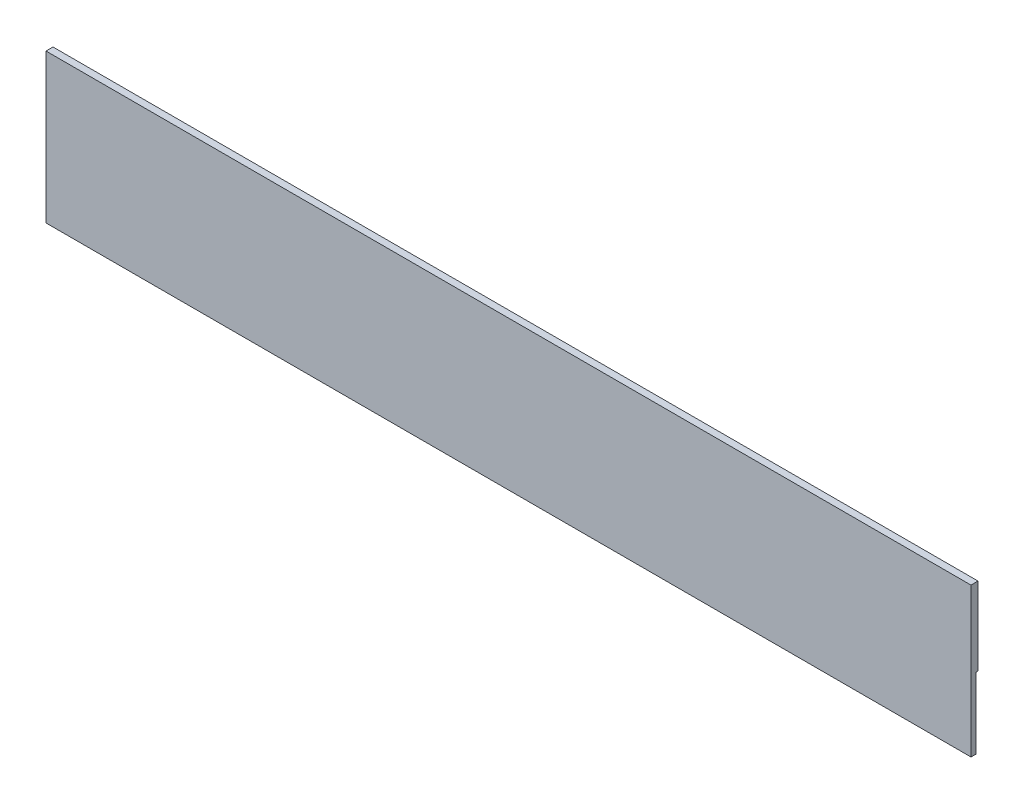
ISO-10303-21;
HEADER;
FILE_DESCRIPTION(('STEP AP214'),'2;1');
FILE_NAME('part.step','',(''),(''),'','','');
FILE_SCHEMA(('AUTOMOTIVE_DESIGN { 1 0 10303 214 1 1 1 1 }'));
ENDSEC;
DATA;
#1=APPLICATION_CONTEXT('core data for automotive mechanical design processes');
#2=APPLICATION_PROTOCOL_DEFINITION('international standard','automotive_design',2000,#1);
#3=PRODUCT_CONTEXT('',#1,'mechanical');
#4=PRODUCT('Part','Part','',(#3));
#5=PRODUCT_RELATED_PRODUCT_CATEGORY('part','',(#4));
#6=PRODUCT_DEFINITION_FORMATION('','',#4);
#7=PRODUCT_DEFINITION_CONTEXT('part definition',#1,'design');
#8=PRODUCT_DEFINITION('design','',#6,#7);
#9=PRODUCT_DEFINITION_SHAPE('','',#8);
#10=(LENGTH_UNIT() NAMED_UNIT(*) SI_UNIT(.MILLI.,.METRE.));
#11=(NAMED_UNIT(*) PLANE_ANGLE_UNIT() SI_UNIT($,.RADIAN.));
#12=(NAMED_UNIT(*) SI_UNIT($,.STERADIAN.) SOLID_ANGLE_UNIT());
#13=UNCERTAINTY_MEASURE_WITH_UNIT(LENGTH_MEASURE(1.E-05),#10,'distance_accuracy_value','');
#14=(GEOMETRIC_REPRESENTATION_CONTEXT(3) GLOBAL_UNCERTAINTY_ASSIGNED_CONTEXT((#13)) GLOBAL_UNIT_ASSIGNED_CONTEXT((#10,
#11,#12)) REPRESENTATION_CONTEXT('',''));
#15=CARTESIAN_POINT('',(0.,0.,0.));
#16=DIRECTION('',(0.,0.,1.));
#17=DIRECTION('',(1.,0.,0.));
#18=AXIS2_PLACEMENT_3D('',#15,#16,#17);
#19=CARTESIAN_POINT('',(0.,0.,76.2));
#20=DIRECTION('',(1.,0.,0.));
#21=DIRECTION('',(0.,1.,0.));
#22=AXIS2_PLACEMENT_3D('',#19,#20,#21);
#23=PLANE('',#22);
#24=DIRECTION('',(0.,0.,-1.));
#25=VECTOR('',#24,1.);
#26=CARTESIAN_POINT('',(-1.77635683940025E-12,2159.,76.2));
#27=LINE('',#26,#25);
#28=CARTESIAN_POINT('',(-1.77635683940025E-12,2159.,76.2));
#29=VERTEX_POINT('',#28);
#30=CARTESIAN_POINT('',(-2.66453525910038E-12,2159.,-25.4));
#31=VERTEX_POINT('',#30);
#32=EDGE_CURVE('E129',#29,#31,#27,.T.);
#33=ORIENTED_EDGE('',*,*,#32,.T.);
#34=DIRECTION('',(0.,1.,0.));
#35=VECTOR('',#34,1.);
#36=CARTESIAN_POINT('',(0.,1028.7,-25.4));
#37=LINE('',#36,#35);
#38=CARTESIAN_POINT('',(0.,1028.7,-25.4));
#39=VERTEX_POINT('',#38);
#40=EDGE_CURVE('E105',#39,#31,#37,.T.);
#41=ORIENTED_EDGE('',*,*,#40,.F.);
#42=DIRECTION('',(0.,0.,1.));
#43=VECTOR('',#42,1.);
#44=CARTESIAN_POINT('',(0.,1028.7,-25.4));
#45=LINE('',#44,#43);
#46=CARTESIAN_POINT('',(0.,1028.7,0.));
#47=VERTEX_POINT('',#46);
#48=EDGE_CURVE('E101',#39,#47,#45,.T.);
#49=ORIENTED_EDGE('',*,*,#48,.T.);
#50=DIRECTION('',(0.,-1.,0.));
#51=VECTOR('',#50,1.);
#52=CARTESIAN_POINT('',(0.,0.,0.));
#53=LINE('',#52,#51);
#54=CARTESIAN_POINT('',(0.,0.,0.));
#55=VERTEX_POINT('',#54);
#56=EDGE_CURVE('E118',#47,#55,#53,.T.);
#57=ORIENTED_EDGE('',*,*,#56,.T.);
#58=DIRECTION('',(0.,0.,-1.));
#59=VECTOR('',#58,1.);
#60=CARTESIAN_POINT('',(0.,0.,76.2));
#61=LINE('',#60,#59);
#62=CARTESIAN_POINT('',(0.,0.,76.2));
#63=VERTEX_POINT('',#62);
#64=EDGE_CURVE('E11',#63,#55,#61,.T.);
#65=ORIENTED_EDGE('',*,*,#64,.F.);
#66=DIRECTION('',(0.,-1.,0.));
#67=VECTOR('',#66,1.);
#68=CARTESIAN_POINT('',(0.,0.,76.2));
#69=LINE('',#68,#67);
#70=EDGE_CURVE('E124',#29,#63,#69,.T.);
#71=ORIENTED_EDGE('',*,*,#70,.F.);
#72=EDGE_LOOP('',(#33,#41,#49,#57,#65,#71));
#73=FACE_BOUND('',#72,.T.);
#74=ADVANCED_FACE('F35',(#73),#23,.F.);
#75=CARTESIAN_POINT('',(0.,0.,76.2));
#76=DIRECTION('',(0.,1.,0.));
#77=DIRECTION('',(0.,0.,1.));
#78=AXIS2_PLACEMENT_3D('',#75,#76,#77);
#79=PLANE('',#78);
#80=DIRECTION('',(1.,0.,0.));
#81=VECTOR('',#80,1.);
#82=CARTESIAN_POINT('',(0.,0.,0.));
#83=LINE('',#82,#81);
#84=CARTESIAN_POINT('',(13411.2,0.,0.));
#85=VERTEX_POINT('',#84);
#86=EDGE_CURVE('E73',#55,#85,#83,.T.);
#87=ORIENTED_EDGE('',*,*,#86,.T.);
#88=DIRECTION('',(0.,0.,-1.));
#89=VECTOR('',#88,1.);
#90=CARTESIAN_POINT('',(13411.2,0.,76.2));
#91=LINE('',#90,#89);
#92=CARTESIAN_POINT('',(13411.2,0.,76.2));
#93=VERTEX_POINT('',#92);
#94=EDGE_CURVE('E42',#93,#85,#91,.T.);
#95=ORIENTED_EDGE('',*,*,#94,.F.);
#96=DIRECTION('',(1.,0.,0.));
#97=VECTOR('',#96,1.);
#98=CARTESIAN_POINT('',(0.,0.,76.2));
#99=LINE('',#98,#97);
#100=EDGE_CURVE('E78',#63,#93,#99,.T.);
#101=ORIENTED_EDGE('',*,*,#100,.F.);
#102=ORIENTED_EDGE('',*,*,#64,.T.);
#103=EDGE_LOOP('',(#87,#95,#101,#102));
#104=FACE_BOUND('',#103,.T.);
#105=ADVANCED_FACE('F138',(#104),#79,.F.);
#106=CARTESIAN_POINT('',(13411.2,0.,76.2));
#107=DIRECTION('',(-1.,0.,0.));
#108=DIRECTION('',(0.,-1.,0.));
#109=AXIS2_PLACEMENT_3D('',#106,#107,#108);
#110=PLANE('',#109);
#111=DIRECTION('',(0.,1.,0.));
#112=VECTOR('',#111,1.);
#113=CARTESIAN_POINT('',(13411.2,0.,0.));
#114=LINE('',#113,#112);
#115=CARTESIAN_POINT('',(13411.2,1028.7,0.));
#116=VERTEX_POINT('',#115);
#117=EDGE_CURVE('E117',#85,#116,#114,.T.);
#118=ORIENTED_EDGE('',*,*,#117,.T.);
#119=DIRECTION('',(0.,0.,1.));
#120=VECTOR('',#119,1.);
#121=CARTESIAN_POINT('',(13411.2,1028.7,-25.4));
#122=LINE('',#121,#120);
#123=CARTESIAN_POINT('',(13411.2,1028.7,-25.4));
#124=VERTEX_POINT('',#123);
#125=EDGE_CURVE('E99',#124,#116,#122,.T.);
#126=ORIENTED_EDGE('',*,*,#125,.F.);
#127=DIRECTION('',(0.,-1.,0.));
#128=VECTOR('',#127,1.);
#129=CARTESIAN_POINT('',(13411.2,1028.7,-25.4));
#130=LINE('',#129,#128);
#131=CARTESIAN_POINT('',(13411.2,2159.,-25.4));
#132=VERTEX_POINT('',#131);
#133=EDGE_CURVE('E106',#132,#124,#130,.T.);
#134=ORIENTED_EDGE('',*,*,#133,.F.);
#135=DIRECTION('',(0.,0.,-1.));
#136=VECTOR('',#135,1.);
#137=CARTESIAN_POINT('',(13411.2,2159.,76.2));
#138=LINE('',#137,#136);
#139=CARTESIAN_POINT('',(13411.2,2159.,76.2));
#140=VERTEX_POINT('',#139);
#141=EDGE_CURVE('E134',#140,#132,#138,.T.);
#142=ORIENTED_EDGE('',*,*,#141,.F.);
#143=DIRECTION('',(0.,1.,0.));
#144=VECTOR('',#143,1.);
#145=CARTESIAN_POINT('',(13411.2,0.,76.2));
#146=LINE('',#145,#144);
#147=EDGE_CURVE('E127',#93,#140,#146,.T.);
#148=ORIENTED_EDGE('',*,*,#147,.F.);
#149=ORIENTED_EDGE('',*,*,#94,.T.);
#150=EDGE_LOOP('',(#118,#126,#134,#142,#148,#149));
#151=FACE_BOUND('',#150,.T.);
#152=ADVANCED_FACE('F116',(#151),#110,.F.);
#153=CARTESIAN_POINT('',(-1.77635683940025E-12,2159.,76.2));
#154=DIRECTION('',(0.,-1.,0.));
#155=DIRECTION('',(0.,0.,-1.));
#156=AXIS2_PLACEMENT_3D('',#153,#154,#155);
#157=PLANE('',#156);
#158=ORIENTED_EDGE('',*,*,#141,.T.);
#159=DIRECTION('',(1.,0.,0.));
#160=VECTOR('',#159,1.);
#161=CARTESIAN_POINT('',(13411.2,2159.,-25.4));
#162=LINE('',#161,#160);
#163=EDGE_CURVE('E112',#31,#132,#162,.T.);
#164=ORIENTED_EDGE('',*,*,#163,.F.);
#165=ORIENTED_EDGE('',*,*,#32,.F.);
#166=DIRECTION('',(-1.,0.,0.));
#167=VECTOR('',#166,1.);
#168=CARTESIAN_POINT('',(-1.77635683940025E-12,2159.,76.2));
#169=LINE('',#168,#167);
#170=EDGE_CURVE('E58',#140,#29,#169,.T.);
#171=ORIENTED_EDGE('',*,*,#170,.F.);
#172=EDGE_LOOP('',(#158,#164,#165,#171));
#173=FACE_BOUND('',#172,.T.);
#174=ADVANCED_FACE('F144',(#173),#157,.F.);
#175=CARTESIAN_POINT('',(0.,0.,76.2));
#176=DIRECTION('',(0.,0.,-1.));
#177=DIRECTION('',(-1.,0.,0.));
#178=AXIS2_PLACEMENT_3D('',#175,#176,#177);
#179=PLANE('',#178);
#180=ORIENTED_EDGE('',*,*,#70,.T.);
#181=ORIENTED_EDGE('',*,*,#100,.T.);
#182=ORIENTED_EDGE('',*,*,#147,.T.);
#183=ORIENTED_EDGE('',*,*,#170,.T.);
#184=EDGE_LOOP('',(#180,#181,#182,#183));
#185=FACE_BOUND('',#184,.T.);
#186=ADVANCED_FACE('F146',(#185),#179,.F.);
#187=CARTESIAN_POINT('',(0.,0.,0.));
#188=DIRECTION('',(0.,0.,-1.));
#189=DIRECTION('',(-1.,0.,0.));
#190=AXIS2_PLACEMENT_3D('',#187,#188,#189);
#191=PLANE('',#190);
#192=DIRECTION('',(-1.,0.,0.));
#193=VECTOR('',#192,1.);
#194=CARTESIAN_POINT('',(13411.2,1028.7,0.));
#195=LINE('',#194,#193);
#196=EDGE_CURVE('E49',#116,#47,#195,.T.);
#197=ORIENTED_EDGE('',*,*,#196,.F.);
#198=ORIENTED_EDGE('',*,*,#117,.F.);
#199=ORIENTED_EDGE('',*,*,#86,.F.);
#200=ORIENTED_EDGE('',*,*,#56,.F.);
#201=EDGE_LOOP('',(#197,#198,#199,#200));
#202=FACE_BOUND('',#201,.T.);
#203=ADVANCED_FACE('F136',(#202),#191,.T.);
#204=CARTESIAN_POINT('',(13411.2,1028.7,-25.4));
#205=DIRECTION('',(0.,1.,0.));
#206=DIRECTION('',(0.,0.,1.));
#207=AXIS2_PLACEMENT_3D('',#204,#205,#206);
#208=PLANE('',#207);
#209=ORIENTED_EDGE('',*,*,#196,.T.);
#210=ORIENTED_EDGE('',*,*,#48,.F.);
#211=DIRECTION('',(-1.,0.,0.));
#212=VECTOR('',#211,1.);
#213=CARTESIAN_POINT('',(13411.2,1028.7,-25.4));
#214=LINE('',#213,#212);
#215=EDGE_CURVE('E95',#124,#39,#214,.T.);
#216=ORIENTED_EDGE('',*,*,#215,.F.);
#217=ORIENTED_EDGE('',*,*,#125,.T.);
#218=EDGE_LOOP('',(#209,#210,#216,#217));
#219=FACE_BOUND('',#218,.T.);
#220=ADVANCED_FACE('F97',(#219),#208,.F.);
#221=CARTESIAN_POINT('',(0.,0.,-25.4));
#222=DIRECTION('',(0.,0.,1.));
#223=DIRECTION('',(1.,0.,0.));
#224=AXIS2_PLACEMENT_3D('',#221,#222,#223);
#225=PLANE('',#224);
#226=ORIENTED_EDGE('',*,*,#133,.T.);
#227=ORIENTED_EDGE('',*,*,#215,.T.);
#228=ORIENTED_EDGE('',*,*,#40,.T.);
#229=ORIENTED_EDGE('',*,*,#163,.T.);
#230=EDGE_LOOP('',(#226,#227,#228,#229));
#231=FACE_BOUND('',#230,.T.);
#232=ADVANCED_FACE('F110',(#231),#225,.F.);
#233=CLOSED_SHELL('',(#74,#105,#152,#174,#186,#203,#220,#232));
#234=MANIFOLD_SOLID_BREP('B2',#233);
#235=ADVANCED_BREP_SHAPE_REPRESENTATION('',(#18,#234),#14);
#236=SHAPE_DEFINITION_REPRESENTATION(#9,#235);
ENDSEC;
END-ISO-10303-21;
